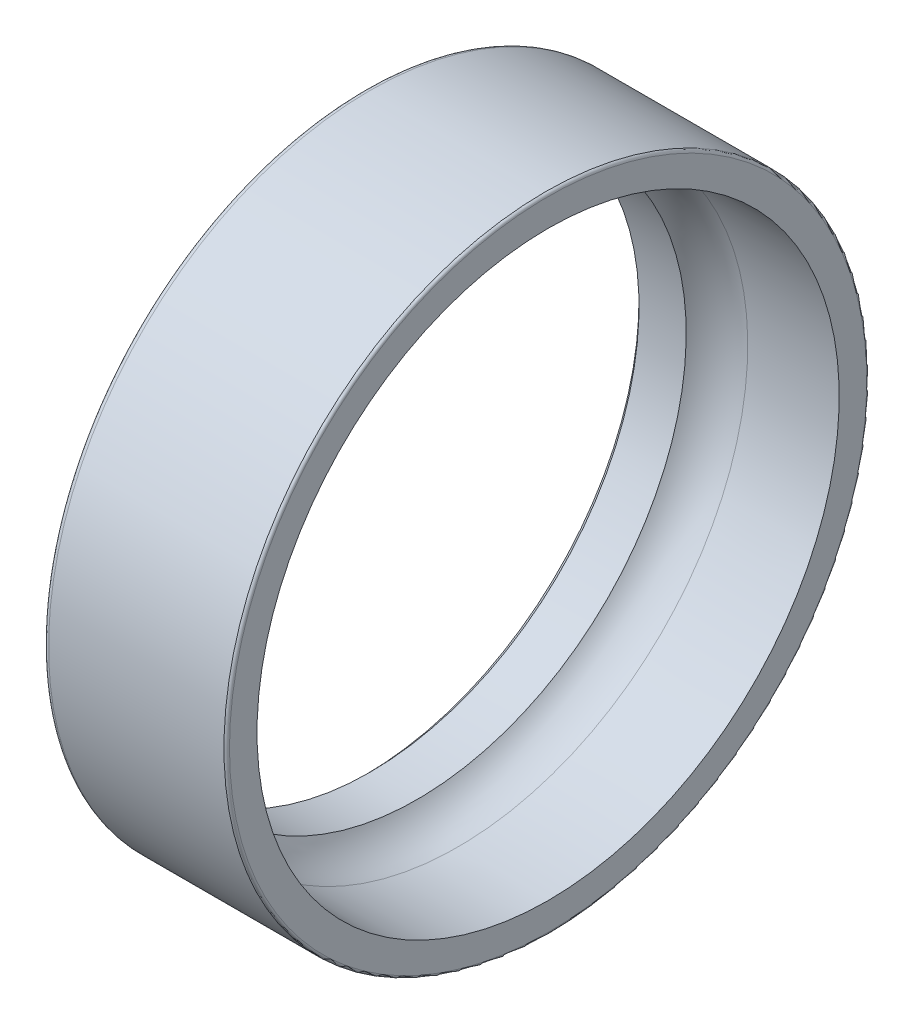
ISO-10303-21;
HEADER;
FILE_DESCRIPTION(('STEP AP214'),'2;1');
FILE_NAME('part.step','',(''),(''),'','','');
FILE_SCHEMA(('AUTOMOTIVE_DESIGN { 1 0 10303 214 1 1 1 1 }'));
ENDSEC;
DATA;
#1=APPLICATION_CONTEXT('core data for automotive mechanical design processes');
#2=APPLICATION_PROTOCOL_DEFINITION('international standard','automotive_design',2000,#1);
#3=PRODUCT_CONTEXT('',#1,'mechanical');
#4=PRODUCT('Part','Part','',(#3));
#5=PRODUCT_RELATED_PRODUCT_CATEGORY('part','',(#4));
#6=PRODUCT_DEFINITION_FORMATION('','',#4);
#7=PRODUCT_DEFINITION_CONTEXT('part definition',#1,'design');
#8=PRODUCT_DEFINITION('design','',#6,#7);
#9=PRODUCT_DEFINITION_SHAPE('','',#8);
#10=(LENGTH_UNIT() NAMED_UNIT(*) SI_UNIT(.MILLI.,.METRE.));
#11=(NAMED_UNIT(*) PLANE_ANGLE_UNIT() SI_UNIT($,.RADIAN.));
#12=(NAMED_UNIT(*) SI_UNIT($,.STERADIAN.) SOLID_ANGLE_UNIT());
#13=UNCERTAINTY_MEASURE_WITH_UNIT(LENGTH_MEASURE(1.E-05),#10,'distance_accuracy_value','');
#14=(GEOMETRIC_REPRESENTATION_CONTEXT(3) GLOBAL_UNCERTAINTY_ASSIGNED_CONTEXT((#13)) GLOBAL_UNIT_ASSIGNED_CONTEXT((#10,
#11,#12)) REPRESENTATION_CONTEXT('',''));
#15=CARTESIAN_POINT('',(0.,0.,0.));
#16=DIRECTION('',(0.,0.,1.));
#17=DIRECTION('',(1.,0.,0.));
#18=AXIS2_PLACEMENT_3D('',#15,#16,#17);
#19=CARTESIAN_POINT('',(0.,16.075,0.));
#20=DIRECTION('',(-1.,0.,0.));
#21=DIRECTION('',(0.,1.,0.));
#22=AXIS2_PLACEMENT_3D('',#19,#20,#21);
#23=PLANE('',#22);
#24=CARTESIAN_POINT('',(0.,0.,0.));
#25=DIRECTION('',(1.,0.,0.));
#26=DIRECTION('',(0.,1.,0.));
#27=AXIS2_PLACEMENT_3D('',#24,#25,#26);
#28=CIRCLE('',#27,14.95);
#29=CARTESIAN_POINT('',(0.,-14.95,0.));
#30=VERTEX_POINT('',#29);
#31=EDGE_CURVE('E86',#30,#30,#28,.T.);
#32=ORIENTED_EDGE('',*,*,#31,.T.);
#33=EDGE_LOOP('',(#32));
#34=FACE_BOUND('',#33,.T.);
#35=CARTESIAN_POINT('',(0.,0.,0.));
#36=DIRECTION('',(1.,0.,0.));
#37=DIRECTION('',(0.,1.,0.));
#38=AXIS2_PLACEMENT_3D('',#35,#36,#37);
#39=CIRCLE('',#38,17.2);
#40=CARTESIAN_POINT('',(0.,0.,17.2));
#41=VERTEX_POINT('',#40);
#42=EDGE_CURVE('E72',#41,#41,#39,.T.);
#43=ORIENTED_EDGE('',*,*,#42,.F.);
#44=EDGE_LOOP('',(#43));
#45=FACE_BOUND('',#44,.T.);
#46=ADVANCED_FACE('F17',(#34,#45),#23,.T.);
#47=CARTESIAN_POINT('',(10.,16.6,0.));
#48=DIRECTION('',(1.,0.,0.));
#49=DIRECTION('',(0.,1.,0.));
#50=AXIS2_PLACEMENT_3D('',#47,#48,#49);
#51=PLANE('',#50);
#52=CARTESIAN_POINT('',(10.,0.,0.));
#53=DIRECTION('',(1.,0.,0.));
#54=DIRECTION('',(0.,1.,0.));
#55=AXIS2_PLACEMENT_3D('',#52,#53,#54);
#56=CIRCLE('',#55,15.85);
#57=CARTESIAN_POINT('',(10.,-15.85,0.));
#58=VERTEX_POINT('',#57);
#59=EDGE_CURVE('E80',#58,#58,#56,.T.);
#60=ORIENTED_EDGE('',*,*,#59,.F.);
#61=EDGE_LOOP('',(#60));
#62=FACE_BOUND('',#61,.T.);
#63=CARTESIAN_POINT('',(10.,0.,0.));
#64=DIRECTION('',(1.,0.,0.));
#65=DIRECTION('',(0.,1.,0.));
#66=AXIS2_PLACEMENT_3D('',#63,#64,#65);
#67=CIRCLE('',#66,17.35);
#68=CARTESIAN_POINT('',(10.,0.,17.35));
#69=VERTEX_POINT('',#68);
#70=EDGE_CURVE('E27',#69,#69,#67,.T.);
#71=ORIENTED_EDGE('',*,*,#70,.T.);
#72=EDGE_LOOP('',(#71));
#73=FACE_BOUND('',#72,.T.);
#74=ADVANCED_FACE('F114',(#62,#73),#51,.T.);
#75=CARTESIAN_POINT('',(5.075,0.,0.));
#76=DIRECTION('',(1.,0.,0.));
#77=DIRECTION('',(0.,1.,0.));
#78=AXIS2_PLACEMENT_3D('',#75,#76,#77);
#79=CYLINDRICAL_SURFACE('',#78,17.5);
#80=CARTESIAN_POINT('',(0.3,0.,0.));
#81=DIRECTION('',(1.,0.,0.));
#82=DIRECTION('',(0.,1.,0.));
#83=AXIS2_PLACEMENT_3D('',#80,#81,#82);
#84=CIRCLE('',#83,17.5);
#85=CARTESIAN_POINT('',(0.3,-17.5,0.));
#86=VERTEX_POINT('',#85);
#87=EDGE_CURVE('E67',#86,#86,#84,.T.);
#88=ORIENTED_EDGE('',*,*,#87,.T.);
#89=EDGE_LOOP('',(#88));
#90=FACE_BOUND('',#89,.T.);
#91=CARTESIAN_POINT('',(9.85,0.,0.));
#92=DIRECTION('',(1.,0.,0.));
#93=DIRECTION('',(0.,1.,0.));
#94=AXIS2_PLACEMENT_3D('',#91,#92,#93);
#95=CIRCLE('',#94,17.5);
#96=CARTESIAN_POINT('',(9.85,-17.5,0.));
#97=VERTEX_POINT('',#96);
#98=EDGE_CURVE('E11',#97,#97,#95,.T.);
#99=ORIENTED_EDGE('',*,*,#98,.F.);
#100=EDGE_LOOP('',(#99));
#101=FACE_BOUND('',#100,.T.);
#102=ADVANCED_FACE('F68',(#90,#101),#79,.T.);
#103=CARTESIAN_POINT('',(9.85,0.,0.));
#104=DIRECTION('',(1.,0.,0.));
#105=DIRECTION('',(0.,0.,-1.));
#106=AXIS2_PLACEMENT_3D('',#103,#104,#105);
#107=TOROIDAL_SURFACE('',#106,17.35,0.15);
#108=ORIENTED_EDGE('',*,*,#98,.T.);
#109=EDGE_LOOP('',(#108));
#110=FACE_BOUND('',#109,.T.);
#111=ORIENTED_EDGE('',*,*,#70,.F.);
#112=EDGE_LOOP('',(#111));
#113=FACE_BOUND('',#112,.T.);
#114=ADVANCED_FACE('F109',(#110,#113),#107,.T.);
#115=CARTESIAN_POINT('',(7.53972797663363,0.,0.));
#116=DIRECTION('',(1.,0.,0.));
#117=DIRECTION('',(0.,1.,0.));
#118=AXIS2_PLACEMENT_3D('',#115,#116,#117);
#119=CONICAL_SURFACE('',#118,15.819896030788,0.0122354222083205);
#120=CARTESIAN_POINT('',(5.07945595326726,0.,0.));
#121=DIRECTION('',(1.,0.,0.));
#122=DIRECTION('',(0.,1.,0.));
#123=AXIS2_PLACEMENT_3D('',#120,#121,#122);
#124=CIRCLE('',#123,15.789792061576);
#125=CARTESIAN_POINT('',(5.07945595326726,15.789792061576,0.));
#126=VERTEX_POINT('',#125);
#127=EDGE_CURVE('E82',#126,#126,#124,.T.);
#128=ORIENTED_EDGE('',*,*,#127,.F.);
#129=EDGE_LOOP('',(#128));
#130=FACE_BOUND('',#129,.T.);
#131=ORIENTED_EDGE('',*,*,#59,.T.);
#132=EDGE_LOOP('',(#131));
#133=FACE_BOUND('',#132,.T.);
#134=ADVANCED_FACE('F98',(#130,#133),#119,.F.);
#135=CARTESIAN_POINT('',(5.11344510808623,0.,0.));
#136=DIRECTION('',(1.,0.,0.));
#137=DIRECTION('',(0.,0.,-1.));
#138=AXIS2_PLACEMENT_3D('',#135,#136,#137);
#139=TOROIDAL_SURFACE('',#138,13.012,2.778);
#140=ORIENTED_EDGE('',*,*,#127,.T.);
#141=EDGE_LOOP('',(#140));
#142=FACE_BOUND('',#141,.T.);
#143=CARTESIAN_POINT('',(2.86973389672235,0.,0.));
#144=DIRECTION('',(1.,0.,0.));
#145=DIRECTION('',(0.,1.,0.));
#146=AXIS2_PLACEMENT_3D('',#143,#144,#145);
#147=CIRCLE('',#146,14.65);
#148=CARTESIAN_POINT('',(2.86973389672235,0.,14.65));
#149=VERTEX_POINT('',#148);
#150=EDGE_CURVE('E85',#149,#149,#147,.T.);
#151=ORIENTED_EDGE('',*,*,#150,.F.);
#152=EDGE_LOOP('',(#151));
#153=FACE_BOUND('',#152,.T.);
#154=ADVANCED_FACE('F96',(#142,#153),#139,.F.);
#155=CARTESIAN_POINT('',(1.58486694836117,0.,0.));
#156=DIRECTION('',(1.,0.,0.));
#157=DIRECTION('',(0.,1.,0.));
#158=AXIS2_PLACEMENT_3D('',#155,#156,#157);
#159=CYLINDRICAL_SURFACE('',#158,14.65);
#160=CARTESIAN_POINT('',(0.3,0.,0.));
#161=DIRECTION('',(1.,0.,0.));
#162=DIRECTION('',(0.,1.,0.));
#163=AXIS2_PLACEMENT_3D('',#160,#161,#162);
#164=CIRCLE('',#163,14.65);
#165=CARTESIAN_POINT('',(0.3,-14.65,0.));
#166=VERTEX_POINT('',#165);
#167=EDGE_CURVE('E20',#166,#166,#164,.T.);
#168=ORIENTED_EDGE('',*,*,#167,.F.);
#169=EDGE_LOOP('',(#168));
#170=FACE_BOUND('',#169,.T.);
#171=ORIENTED_EDGE('',*,*,#150,.T.);
#172=EDGE_LOOP('',(#171));
#173=FACE_BOUND('',#172,.T.);
#174=ADVANCED_FACE('F94',(#170,#173),#159,.F.);
#175=CARTESIAN_POINT('',(0.15,0.,0.));
#176=DIRECTION('',(-1.,0.,0.));
#177=DIRECTION('',(0.,1.,0.));
#178=AXIS2_PLACEMENT_3D('',#175,#176,#177);
#179=CONICAL_SURFACE('',#178,14.8,0.785398163397447);
#180=ORIENTED_EDGE('',*,*,#31,.F.);
#181=EDGE_LOOP('',(#180));
#182=FACE_BOUND('',#181,.T.);
#183=ORIENTED_EDGE('',*,*,#167,.T.);
#184=EDGE_LOOP('',(#183));
#185=FACE_BOUND('',#184,.T.);
#186=ADVANCED_FACE('F106',(#182,#185),#179,.F.);
#187=CARTESIAN_POINT('',(0.3,0.,0.));
#188=DIRECTION('',(1.,0.,0.));
#189=DIRECTION('',(0.,0.,-1.));
#190=AXIS2_PLACEMENT_3D('',#187,#188,#189);
#191=TOROIDAL_SURFACE('',#190,17.2,0.3);
#192=ORIENTED_EDGE('',*,*,#42,.T.);
#193=EDGE_LOOP('',(#192));
#194=FACE_BOUND('',#193,.T.);
#195=ORIENTED_EDGE('',*,*,#87,.F.);
#196=EDGE_LOOP('',(#195));
#197=FACE_BOUND('',#196,.T.);
#198=ADVANCED_FACE('F125',(#194,#197),#191,.T.);
#199=CLOSED_SHELL('',(#46,#74,#102,#114,#134,#154,#174,#186,#198));
#200=MANIFOLD_SOLID_BREP('B1',#199);
#201=ADVANCED_BREP_SHAPE_REPRESENTATION('',(#18,#200),#14);
#202=SHAPE_DEFINITION_REPRESENTATION(#9,#201);
ENDSEC;
END-ISO-10303-21;
